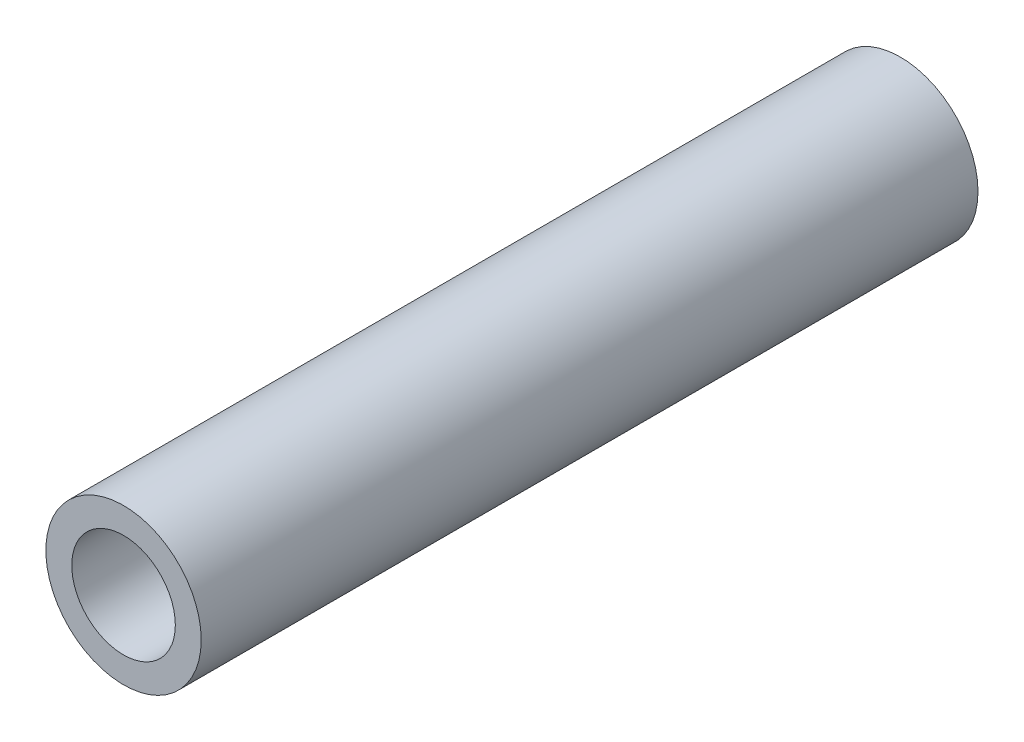
ISO-10303-21;
HEADER;
FILE_DESCRIPTION(('STEP AP214'),'2;1');
FILE_NAME('part.step','',(''),(''),'','','');
FILE_SCHEMA(('AUTOMOTIVE_DESIGN { 1 0 10303 214 1 1 1 1 }'));
ENDSEC;
DATA;
#1=APPLICATION_CONTEXT('core data for automotive mechanical design processes');
#2=APPLICATION_PROTOCOL_DEFINITION('international standard','automotive_design',2000,#1);
#3=PRODUCT_CONTEXT('',#1,'mechanical');
#4=PRODUCT('Part','Part','',(#3));
#5=PRODUCT_RELATED_PRODUCT_CATEGORY('part','',(#4));
#6=PRODUCT_DEFINITION_FORMATION('','',#4);
#7=PRODUCT_DEFINITION_CONTEXT('part definition',#1,'design');
#8=PRODUCT_DEFINITION('design','',#6,#7);
#9=PRODUCT_DEFINITION_SHAPE('','',#8);
#10=(LENGTH_UNIT() NAMED_UNIT(*) SI_UNIT(.MILLI.,.METRE.));
#11=(NAMED_UNIT(*) PLANE_ANGLE_UNIT() SI_UNIT($,.RADIAN.));
#12=(NAMED_UNIT(*) SI_UNIT($,.STERADIAN.) SOLID_ANGLE_UNIT());
#13=UNCERTAINTY_MEASURE_WITH_UNIT(LENGTH_MEASURE(1.E-05),#10,'distance_accuracy_value','');
#14=(GEOMETRIC_REPRESENTATION_CONTEXT(3) GLOBAL_UNCERTAINTY_ASSIGNED_CONTEXT((#13)) GLOBAL_UNIT_ASSIGNED_CONTEXT((#10,
#11,#12)) REPRESENTATION_CONTEXT('',''));
#15=CARTESIAN_POINT('',(0.,0.,0.));
#16=DIRECTION('',(0.,0.,1.));
#17=DIRECTION('',(1.,0.,0.));
#18=AXIS2_PLACEMENT_3D('',#15,#16,#17);
#19=CARTESIAN_POINT('',(0.,0.,30.));
#20=DIRECTION('',(0.,0.,1.));
#21=DIRECTION('',(1.,0.,0.));
#22=AXIS2_PLACEMENT_3D('',#19,#20,#21);
#23=PLANE('',#22);
#24=CARTESIAN_POINT('',(0.,0.,30.));
#25=DIRECTION('',(0.,0.,1.));
#26=DIRECTION('',(1.,0.,0.));
#27=AXIS2_PLACEMENT_3D('',#24,#25,#26);
#28=CIRCLE('',#27,3.);
#29=CARTESIAN_POINT('',(3.,0.,30.));
#30=VERTEX_POINT('',#29);
#31=EDGE_CURVE('E10',#30,#30,#28,.T.);
#32=ORIENTED_EDGE('',*,*,#31,.T.);
#33=EDGE_LOOP('',(#32));
#34=FACE_BOUND('',#33,.T.);
#35=CARTESIAN_POINT('',(0.,0.,30.));
#36=DIRECTION('',(0.,0.,1.));
#37=DIRECTION('',(1.,0.,0.));
#38=AXIS2_PLACEMENT_3D('',#35,#36,#37);
#39=CIRCLE('',#38,2.);
#40=CARTESIAN_POINT('',(2.,0.,30.));
#41=VERTEX_POINT('',#40);
#42=EDGE_CURVE('E42',#41,#41,#39,.T.);
#43=ORIENTED_EDGE('',*,*,#42,.F.);
#44=EDGE_LOOP('',(#43));
#45=FACE_BOUND('',#44,.T.);
#46=ADVANCED_FACE('F31',(#34,#45),#23,.T.);
#47=CARTESIAN_POINT('',(0.,0.,0.));
#48=DIRECTION('',(0.,0.,1.));
#49=DIRECTION('',(1.,0.,0.));
#50=AXIS2_PLACEMENT_3D('',#47,#48,#49);
#51=PLANE('',#50);
#52=CARTESIAN_POINT('',(0.,0.,0.));
#53=DIRECTION('',(0.,0.,1.));
#54=DIRECTION('',(1.,0.,0.));
#55=AXIS2_PLACEMENT_3D('',#52,#53,#54);
#56=CIRCLE('',#55,3.);
#57=CARTESIAN_POINT('',(3.,0.,0.));
#58=VERTEX_POINT('',#57);
#59=EDGE_CURVE('E35',#58,#58,#56,.T.);
#60=ORIENTED_EDGE('',*,*,#59,.F.);
#61=EDGE_LOOP('',(#60));
#62=FACE_BOUND('',#61,.T.);
#63=CARTESIAN_POINT('',(0.,0.,0.));
#64=DIRECTION('',(0.,0.,1.));
#65=DIRECTION('',(1.,0.,0.));
#66=AXIS2_PLACEMENT_3D('',#63,#64,#65);
#67=CIRCLE('',#66,2.);
#68=CARTESIAN_POINT('',(2.,0.,0.));
#69=VERTEX_POINT('',#68);
#70=EDGE_CURVE('E44',#69,#69,#67,.T.);
#71=ORIENTED_EDGE('',*,*,#70,.T.);
#72=EDGE_LOOP('',(#71));
#73=FACE_BOUND('',#72,.T.);
#74=ADVANCED_FACE('F54',(#62,#73),#51,.F.);
#75=CARTESIAN_POINT('',(0.,0.,30.));
#76=DIRECTION('',(0.,0.,-1.));
#77=DIRECTION('',(-1.,0.,0.));
#78=AXIS2_PLACEMENT_3D('',#75,#76,#77);
#79=CYLINDRICAL_SURFACE('',#78,3.);
#80=ORIENTED_EDGE('',*,*,#31,.F.);
#81=EDGE_LOOP('',(#80));
#82=FACE_BOUND('',#81,.T.);
#83=ORIENTED_EDGE('',*,*,#59,.T.);
#84=EDGE_LOOP('',(#83));
#85=FACE_BOUND('',#84,.T.);
#86=ADVANCED_FACE('F33',(#82,#85),#79,.T.);
#87=CARTESIAN_POINT('',(0.,0.,30.));
#88=DIRECTION('',(0.,0.,-1.));
#89=DIRECTION('',(-1.,0.,0.));
#90=AXIS2_PLACEMENT_3D('',#87,#88,#89);
#91=CYLINDRICAL_SURFACE('',#90,2.);
#92=ORIENTED_EDGE('',*,*,#42,.T.);
#93=EDGE_LOOP('',(#92));
#94=FACE_BOUND('',#93,.T.);
#95=ORIENTED_EDGE('',*,*,#70,.F.);
#96=EDGE_LOOP('',(#95));
#97=FACE_BOUND('',#96,.T.);
#98=ADVANCED_FACE('F50',(#94,#97),#91,.F.);
#99=CLOSED_SHELL('',(#46,#74,#86,#98));
#100=MANIFOLD_SOLID_BREP('B2',#99);
#101=ADVANCED_BREP_SHAPE_REPRESENTATION('',(#18,#100),#14);
#102=SHAPE_DEFINITION_REPRESENTATION(#9,#101);
ENDSEC;
END-ISO-10303-21;
